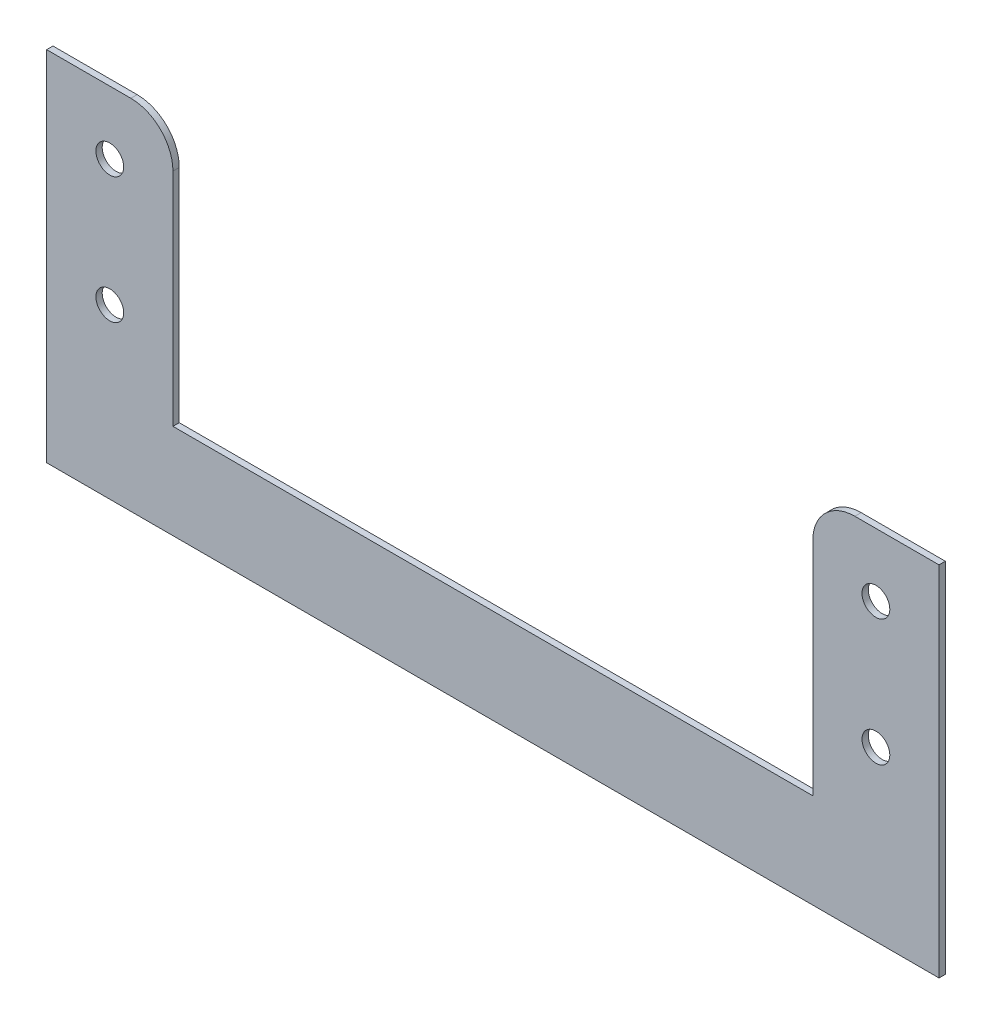
ISO-10303-21;
HEADER;
FILE_DESCRIPTION(('STEP AP214'),'2;1');
FILE_NAME('part.step','',(''),(''),'','','');
FILE_SCHEMA(('AUTOMOTIVE_DESIGN { 1 0 10303 214 1 1 1 1 }'));
ENDSEC;
DATA;
#1=APPLICATION_CONTEXT('core data for automotive mechanical design processes');
#2=APPLICATION_PROTOCOL_DEFINITION('international standard','automotive_design',2000,#1);
#3=PRODUCT_CONTEXT('',#1,'mechanical');
#4=PRODUCT('Part','Part','',(#3));
#5=PRODUCT_RELATED_PRODUCT_CATEGORY('part','',(#4));
#6=PRODUCT_DEFINITION_FORMATION('','',#4);
#7=PRODUCT_DEFINITION_CONTEXT('part definition',#1,'design');
#8=PRODUCT_DEFINITION('design','',#6,#7);
#9=PRODUCT_DEFINITION_SHAPE('','',#8);
#10=(LENGTH_UNIT() NAMED_UNIT(*) SI_UNIT(.MILLI.,.METRE.));
#11=(NAMED_UNIT(*) PLANE_ANGLE_UNIT() SI_UNIT($,.RADIAN.));
#12=(NAMED_UNIT(*) SI_UNIT($,.STERADIAN.) SOLID_ANGLE_UNIT());
#13=UNCERTAINTY_MEASURE_WITH_UNIT(LENGTH_MEASURE(1.E-05),#10,'distance_accuracy_value','');
#14=(GEOMETRIC_REPRESENTATION_CONTEXT(3) GLOBAL_UNCERTAINTY_ASSIGNED_CONTEXT((#13)) GLOBAL_UNIT_ASSIGNED_CONTEXT((#10,
#11,#12)) REPRESENTATION_CONTEXT('',''));
#15=CARTESIAN_POINT('',(0.,0.,0.));
#16=DIRECTION('',(0.,0.,1.));
#17=DIRECTION('',(1.,0.,0.));
#18=AXIS2_PLACEMENT_3D('',#15,#16,#17);
#19=CARTESIAN_POINT('',(0.,0.,3.));
#20=DIRECTION('',(0.,0.,-1.));
#21=DIRECTION('',(-1.,0.,0.));
#22=AXIS2_PLACEMENT_3D('',#19,#20,#21);
#23=PLANE('',#22);
#24=DIRECTION('',(-1.,0.,0.));
#25=VECTOR('',#24,1.);
#26=CARTESIAN_POINT('',(152.,125.,3.));
#27=LINE('',#26,#25);
#28=CARTESIAN_POINT('',(212.,125.,3.));
#29=VERTEX_POINT('',#28);
#30=CARTESIAN_POINT('',(172.,125.,3.));
#31=VERTEX_POINT('',#30);
#32=EDGE_CURVE('E128',#29,#31,#27,.T.);
#33=ORIENTED_EDGE('',*,*,#32,.T.);
#34=CARTESIAN_POINT('',(172.,105.,3.));
#35=DIRECTION('',(0.,0.,-1.));
#36=DIRECTION('',(-1.,0.,0.));
#37=AXIS2_PLACEMENT_3D('',#34,#35,#36);
#38=CIRCLE('',#37,20.);
#39=CARTESIAN_POINT('',(152.,105.,3.));
#40=VERTEX_POINT('',#39);
#41=EDGE_CURVE('E124',#31,#40,#38,.F.);
#42=ORIENTED_EDGE('',*,*,#41,.T.);
#43=DIRECTION('',(0.,-1.,0.));
#44=VECTOR('',#43,1.);
#45=CARTESIAN_POINT('',(152.,0.,3.));
#46=LINE('',#45,#44);
#47=CARTESIAN_POINT('',(152.,0.,3.));
#48=VERTEX_POINT('',#47);
#49=EDGE_CURVE('E116',#40,#48,#46,.T.);
#50=ORIENTED_EDGE('',*,*,#49,.T.);
#51=DIRECTION('',(-1.,0.,0.));
#52=VECTOR('',#51,1.);
#53=CARTESIAN_POINT('',(152.,0.,3.));
#54=LINE('',#53,#52);
#55=CARTESIAN_POINT('',(-152.,0.,3.));
#56=VERTEX_POINT('',#55);
#57=EDGE_CURVE('E121',#48,#56,#54,.T.);
#58=ORIENTED_EDGE('',*,*,#57,.T.);
#59=DIRECTION('',(0.,1.,0.));
#60=VECTOR('',#59,1.);
#61=CARTESIAN_POINT('',(-152.,0.,3.));
#62=LINE('',#61,#60);
#63=CARTESIAN_POINT('',(-152.,105.,3.));
#64=VERTEX_POINT('',#63);
#65=EDGE_CURVE('E142',#56,#64,#62,.T.);
#66=ORIENTED_EDGE('',*,*,#65,.T.);
#67=CARTESIAN_POINT('',(-172.,105.,3.));
#68=DIRECTION('',(0.,0.,-1.));
#69=DIRECTION('',(-1.,0.,0.));
#70=AXIS2_PLACEMENT_3D('',#67,#68,#69);
#71=CIRCLE('',#70,20.);
#72=CARTESIAN_POINT('',(-172.,125.,3.));
#73=VERTEX_POINT('',#72);
#74=EDGE_CURVE('E56',#64,#73,#71,.F.);
#75=ORIENTED_EDGE('',*,*,#74,.T.);
#76=DIRECTION('',(-1.,0.,0.));
#77=VECTOR('',#76,1.);
#78=CARTESIAN_POINT('',(-152.,125.,3.));
#79=LINE('',#78,#77);
#80=CARTESIAN_POINT('',(-212.,125.,3.));
#81=VERTEX_POINT('',#80);
#82=EDGE_CURVE('E144',#73,#81,#79,.T.);
#83=ORIENTED_EDGE('',*,*,#82,.T.);
#84=DIRECTION('',(0.,-1.,0.));
#85=VECTOR('',#84,1.);
#86=CARTESIAN_POINT('',(-212.,125.,3.));
#87=LINE('',#86,#85);
#88=CARTESIAN_POINT('',(-212.,-45.,3.));
#89=VERTEX_POINT('',#88);
#90=EDGE_CURVE('E149',#81,#89,#87,.T.);
#91=ORIENTED_EDGE('',*,*,#90,.T.);
#92=DIRECTION('',(1.,0.,0.));
#93=VECTOR('',#92,1.);
#94=CARTESIAN_POINT('',(-212.,-45.,3.));
#95=LINE('',#94,#93);
#96=CARTESIAN_POINT('',(212.,-45.,3.));
#97=VERTEX_POINT('',#96);
#98=EDGE_CURVE('E151',#89,#97,#95,.T.);
#99=ORIENTED_EDGE('',*,*,#98,.T.);
#100=DIRECTION('',(0.,1.,0.));
#101=VECTOR('',#100,1.);
#102=CARTESIAN_POINT('',(212.,125.,3.));
#103=LINE('',#102,#101);
#104=EDGE_CURVE('E153',#97,#29,#103,.T.);
#105=ORIENTED_EDGE('',*,*,#104,.T.);
#106=EDGE_LOOP('',(#33,#42,#50,#58,#66,#75,#83,#91,#99,#105));
#107=FACE_BOUND('',#106,.T.);
#108=CARTESIAN_POINT('',(-182.,94.9999999999999,3.));
#109=DIRECTION('',(0.,0.,1.));
#110=DIRECTION('',(1.,0.,0.));
#111=AXIS2_PLACEMENT_3D('',#108,#109,#110);
#112=CIRCLE('',#111,6.60000000000004);
#113=CARTESIAN_POINT('',(-175.4,94.9999999999999,3.));
#114=VERTEX_POINT('',#113);
#115=EDGE_CURVE('E159',#114,#114,#112,.T.);
#116=ORIENTED_EDGE('',*,*,#115,.F.);
#117=EDGE_LOOP('',(#116));
#118=FACE_BOUND('',#117,.T.);
#119=CARTESIAN_POINT('',(-182.,34.9999999999999,3.));
#120=DIRECTION('',(0.,0.,1.));
#121=DIRECTION('',(1.,0.,0.));
#122=AXIS2_PLACEMENT_3D('',#119,#120,#121);
#123=CIRCLE('',#122,6.60000000000007);
#124=CARTESIAN_POINT('',(-175.4,34.9999999999999,3.));
#125=VERTEX_POINT('',#124);
#126=EDGE_CURVE('E228',#125,#125,#123,.T.);
#127=ORIENTED_EDGE('',*,*,#126,.F.);
#128=EDGE_LOOP('',(#127));
#129=FACE_BOUND('',#128,.T.);
#130=CARTESIAN_POINT('',(182.,34.9999999999999,3.));
#131=DIRECTION('',(0.,0.,1.));
#132=DIRECTION('',(-1.,0.,0.));
#133=AXIS2_PLACEMENT_3D('',#130,#131,#132);
#134=CIRCLE('',#133,6.60000000000007);
#135=CARTESIAN_POINT('',(175.4,34.9999999999999,3.));
#136=VERTEX_POINT('',#135);
#137=EDGE_CURVE('E234',#136,#136,#134,.T.);
#138=ORIENTED_EDGE('',*,*,#137,.F.);
#139=EDGE_LOOP('',(#138));
#140=FACE_BOUND('',#139,.T.);
#141=CARTESIAN_POINT('',(182.,94.9999999999999,3.));
#142=DIRECTION('',(0.,0.,1.));
#143=DIRECTION('',(-1.,0.,0.));
#144=AXIS2_PLACEMENT_3D('',#141,#142,#143);
#145=CIRCLE('',#144,6.60000000000004);
#146=CARTESIAN_POINT('',(175.4,94.9999999999999,3.));
#147=VERTEX_POINT('',#146);
#148=EDGE_CURVE('E240',#147,#147,#145,.T.);
#149=ORIENTED_EDGE('',*,*,#148,.F.);
#150=EDGE_LOOP('',(#149));
#151=FACE_BOUND('',#150,.T.);
#152=ADVANCED_FACE('F41',(#107,#118,#129,#140,#151),#23,.F.);
#153=CARTESIAN_POINT('',(0.,0.,0.));
#154=DIRECTION('',(0.,0.,-1.));
#155=DIRECTION('',(-1.,0.,0.));
#156=AXIS2_PLACEMENT_3D('',#153,#154,#155);
#157=PLANE('',#156);
#158=CARTESIAN_POINT('',(182.,34.9999999999999,0.));
#159=DIRECTION('',(0.,0.,1.));
#160=DIRECTION('',(-1.,0.,0.));
#161=AXIS2_PLACEMENT_3D('',#158,#159,#160);
#162=CIRCLE('',#161,6.60000000000007);
#163=CARTESIAN_POINT('',(175.4,34.9999999999999,0.));
#164=VERTEX_POINT('',#163);
#165=EDGE_CURVE('E237',#164,#164,#162,.T.);
#166=ORIENTED_EDGE('',*,*,#165,.T.);
#167=EDGE_LOOP('',(#166));
#168=FACE_BOUND('',#167,.T.);
#169=CARTESIAN_POINT('',(-182.,94.9999999999999,0.));
#170=DIRECTION('',(0.,0.,1.));
#171=DIRECTION('',(1.,0.,0.));
#172=AXIS2_PLACEMENT_3D('',#169,#170,#171);
#173=CIRCLE('',#172,6.60000000000004);
#174=CARTESIAN_POINT('',(-175.4,94.9999999999999,0.));
#175=VERTEX_POINT('',#174);
#176=EDGE_CURVE('E225',#175,#175,#173,.T.);
#177=ORIENTED_EDGE('',*,*,#176,.T.);
#178=EDGE_LOOP('',(#177));
#179=FACE_BOUND('',#178,.T.);
#180=DIRECTION('',(0.,-1.,0.));
#181=VECTOR('',#180,1.);
#182=CARTESIAN_POINT('',(152.,0.,0.));
#183=LINE('',#182,#181);
#184=CARTESIAN_POINT('',(152.,105.,0.));
#185=VERTEX_POINT('',#184);
#186=CARTESIAN_POINT('',(152.,0.,0.));
#187=VERTEX_POINT('',#186);
#188=EDGE_CURVE('E134',#185,#187,#183,.T.);
#189=ORIENTED_EDGE('',*,*,#188,.F.);
#190=CARTESIAN_POINT('',(172.,105.,0.));
#191=DIRECTION('',(0.,0.,-1.));
#192=DIRECTION('',(-1.,0.,0.));
#193=AXIS2_PLACEMENT_3D('',#190,#191,#192);
#194=CIRCLE('',#193,20.);
#195=CARTESIAN_POINT('',(172.,125.,0.));
#196=VERTEX_POINT('',#195);
#197=EDGE_CURVE('E188',#185,#196,#194,.T.);
#198=ORIENTED_EDGE('',*,*,#197,.T.);
#199=DIRECTION('',(-1.,0.,0.));
#200=VECTOR('',#199,1.);
#201=CARTESIAN_POINT('',(152.,125.,0.));
#202=LINE('',#201,#200);
#203=CARTESIAN_POINT('',(212.,125.,0.));
#204=VERTEX_POINT('',#203);
#205=EDGE_CURVE('E156',#204,#196,#202,.T.);
#206=ORIENTED_EDGE('',*,*,#205,.F.);
#207=DIRECTION('',(0.,1.,0.));
#208=VECTOR('',#207,1.);
#209=CARTESIAN_POINT('',(212.,125.,0.));
#210=LINE('',#209,#208);
#211=CARTESIAN_POINT('',(212.,-45.,0.));
#212=VERTEX_POINT('',#211);
#213=EDGE_CURVE('E171',#212,#204,#210,.T.);
#214=ORIENTED_EDGE('',*,*,#213,.F.);
#215=DIRECTION('',(1.,0.,0.));
#216=VECTOR('',#215,1.);
#217=CARTESIAN_POINT('',(-212.,-45.,0.));
#218=LINE('',#217,#216);
#219=CARTESIAN_POINT('',(-212.,-45.,0.));
#220=VERTEX_POINT('',#219);
#221=EDGE_CURVE('E169',#220,#212,#218,.T.);
#222=ORIENTED_EDGE('',*,*,#221,.F.);
#223=DIRECTION('',(0.,-1.,0.));
#224=VECTOR('',#223,1.);
#225=CARTESIAN_POINT('',(-212.,125.,0.));
#226=LINE('',#225,#224);
#227=CARTESIAN_POINT('',(-212.,125.,0.));
#228=VERTEX_POINT('',#227);
#229=EDGE_CURVE('E167',#228,#220,#226,.T.);
#230=ORIENTED_EDGE('',*,*,#229,.F.);
#231=DIRECTION('',(-1.,0.,0.));
#232=VECTOR('',#231,1.);
#233=CARTESIAN_POINT('',(-152.,125.,0.));
#234=LINE('',#233,#232);
#235=CARTESIAN_POINT('',(-172.,125.,0.));
#236=VERTEX_POINT('',#235);
#237=EDGE_CURVE('E165',#236,#228,#234,.T.);
#238=ORIENTED_EDGE('',*,*,#237,.F.);
#239=CARTESIAN_POINT('',(-172.,105.,0.));
#240=DIRECTION('',(0.,0.,-1.));
#241=DIRECTION('',(-1.,0.,0.));
#242=AXIS2_PLACEMENT_3D('',#239,#240,#241);
#243=CIRCLE('',#242,20.);
#244=CARTESIAN_POINT('',(-152.,105.,0.));
#245=VERTEX_POINT('',#244);
#246=EDGE_CURVE('E186',#236,#245,#243,.T.);
#247=ORIENTED_EDGE('',*,*,#246,.T.);
#248=DIRECTION('',(0.,1.,0.));
#249=VECTOR('',#248,1.);
#250=CARTESIAN_POINT('',(-152.,0.,0.));
#251=LINE('',#250,#249);
#252=CARTESIAN_POINT('',(-152.,0.,0.));
#253=VERTEX_POINT('',#252);
#254=EDGE_CURVE('E163',#253,#245,#251,.T.);
#255=ORIENTED_EDGE('',*,*,#254,.F.);
#256=DIRECTION('',(-1.,0.,0.));
#257=VECTOR('',#256,1.);
#258=CARTESIAN_POINT('',(152.,0.,0.));
#259=LINE('',#258,#257);
#260=EDGE_CURVE('E161',#187,#253,#259,.T.);
#261=ORIENTED_EDGE('',*,*,#260,.F.);
#262=EDGE_LOOP('',(#189,#198,#206,#214,#222,#230,#238,#247,#255,#261));
#263=FACE_BOUND('',#262,.T.);
#264=CARTESIAN_POINT('',(-182.,34.9999999999999,0.));
#265=DIRECTION('',(0.,0.,1.));
#266=DIRECTION('',(1.,0.,0.));
#267=AXIS2_PLACEMENT_3D('',#264,#265,#266);
#268=CIRCLE('',#267,6.60000000000007);
#269=CARTESIAN_POINT('',(-175.4,34.9999999999999,0.));
#270=VERTEX_POINT('',#269);
#271=EDGE_CURVE('E231',#270,#270,#268,.T.);
#272=ORIENTED_EDGE('',*,*,#271,.T.);
#273=EDGE_LOOP('',(#272));
#274=FACE_BOUND('',#273,.T.);
#275=CARTESIAN_POINT('',(182.,94.9999999999999,0.));
#276=DIRECTION('',(0.,0.,1.));
#277=DIRECTION('',(-1.,0.,0.));
#278=AXIS2_PLACEMENT_3D('',#275,#276,#277);
#279=CIRCLE('',#278,6.60000000000004);
#280=CARTESIAN_POINT('',(175.4,94.9999999999999,0.));
#281=VERTEX_POINT('',#280);
#282=EDGE_CURVE('E243',#281,#281,#279,.T.);
#283=ORIENTED_EDGE('',*,*,#282,.T.);
#284=EDGE_LOOP('',(#283));
#285=FACE_BOUND('',#284,.T.);
#286=ADVANCED_FACE('F202',(#168,#179,#263,#274,#285),#157,.T.);
#287=CARTESIAN_POINT('',(152.,125.,3.));
#288=DIRECTION('',(0.,-1.,0.));
#289=DIRECTION('',(0.,0.,-1.));
#290=AXIS2_PLACEMENT_3D('',#287,#288,#289);
#291=PLANE('',#290);
#292=ORIENTED_EDGE('',*,*,#205,.T.);
#293=DIRECTION('',(0.,0.,-1.));
#294=VECTOR('',#293,1.);
#295=CARTESIAN_POINT('',(172.,125.,3.));
#296=LINE('',#295,#294);
#297=EDGE_CURVE('E190',#196,#31,#296,.F.);
#298=ORIENTED_EDGE('',*,*,#297,.T.);
#299=ORIENTED_EDGE('',*,*,#32,.F.);
#300=DIRECTION('',(0.,0.,-1.));
#301=VECTOR('',#300,1.);
#302=CARTESIAN_POINT('',(212.,125.,3.));
#303=LINE('',#302,#301);
#304=EDGE_CURVE('E155',#29,#204,#303,.T.);
#305=ORIENTED_EDGE('',*,*,#304,.T.);
#306=EDGE_LOOP('',(#292,#298,#299,#305));
#307=FACE_BOUND('',#306,.T.);
#308=ADVANCED_FACE('F222',(#307),#291,.F.);
#309=CARTESIAN_POINT('',(152.,0.,3.));
#310=DIRECTION('',(1.,0.,0.));
#311=DIRECTION('',(0.,0.,-1.));
#312=AXIS2_PLACEMENT_3D('',#309,#310,#311);
#313=PLANE('',#312);
#314=ORIENTED_EDGE('',*,*,#49,.F.);
#315=DIRECTION('',(0.,0.,-1.));
#316=VECTOR('',#315,1.);
#317=CARTESIAN_POINT('',(152.,105.,3.));
#318=LINE('',#317,#316);
#319=EDGE_CURVE('E137',#40,#185,#318,.T.);
#320=ORIENTED_EDGE('',*,*,#319,.T.);
#321=ORIENTED_EDGE('',*,*,#188,.T.);
#322=DIRECTION('',(0.,0.,-1.));
#323=VECTOR('',#322,1.);
#324=CARTESIAN_POINT('',(152.,0.,3.));
#325=LINE('',#324,#323);
#326=EDGE_CURVE('E131',#48,#187,#325,.T.);
#327=ORIENTED_EDGE('',*,*,#326,.F.);
#328=EDGE_LOOP('',(#314,#320,#321,#327));
#329=FACE_BOUND('',#328,.T.);
#330=ADVANCED_FACE('F132',(#329),#313,.F.);
#331=CARTESIAN_POINT('',(152.,0.,3.));
#332=DIRECTION('',(0.,-1.,0.));
#333=DIRECTION('',(0.,0.,-1.));
#334=AXIS2_PLACEMENT_3D('',#331,#332,#333);
#335=PLANE('',#334);
#336=ORIENTED_EDGE('',*,*,#260,.T.);
#337=DIRECTION('',(0.,0.,-1.));
#338=VECTOR('',#337,1.);
#339=CARTESIAN_POINT('',(-152.,0.,3.));
#340=LINE('',#339,#338);
#341=EDGE_CURVE('E138',#56,#253,#340,.T.);
#342=ORIENTED_EDGE('',*,*,#341,.F.);
#343=ORIENTED_EDGE('',*,*,#57,.F.);
#344=ORIENTED_EDGE('',*,*,#326,.T.);
#345=EDGE_LOOP('',(#336,#342,#343,#344));
#346=FACE_BOUND('',#345,.T.);
#347=ADVANCED_FACE('F140',(#346),#335,.F.);
#348=CARTESIAN_POINT('',(-152.,0.,3.));
#349=DIRECTION('',(-1.,0.,0.));
#350=DIRECTION('',(0.,0.,1.));
#351=AXIS2_PLACEMENT_3D('',#348,#349,#350);
#352=PLANE('',#351);
#353=ORIENTED_EDGE('',*,*,#254,.T.);
#354=DIRECTION('',(0.,0.,-1.));
#355=VECTOR('',#354,1.);
#356=CARTESIAN_POINT('',(-152.,105.,3.));
#357=LINE('',#356,#355);
#358=EDGE_CURVE('E11',#245,#64,#357,.F.);
#359=ORIENTED_EDGE('',*,*,#358,.T.);
#360=ORIENTED_EDGE('',*,*,#65,.F.);
#361=ORIENTED_EDGE('',*,*,#341,.T.);
#362=EDGE_LOOP('',(#353,#359,#360,#361));
#363=FACE_BOUND('',#362,.T.);
#364=ADVANCED_FACE('F272',(#363),#352,.F.);
#365=CARTESIAN_POINT('',(-152.,125.,3.));
#366=DIRECTION('',(0.,-1.,0.));
#367=DIRECTION('',(0.,0.,-1.));
#368=AXIS2_PLACEMENT_3D('',#365,#366,#367);
#369=PLANE('',#368);
#370=ORIENTED_EDGE('',*,*,#82,.F.);
#371=DIRECTION('',(0.,0.,-1.));
#372=VECTOR('',#371,1.);
#373=CARTESIAN_POINT('',(-172.,125.,3.));
#374=LINE('',#373,#372);
#375=EDGE_CURVE('E49',#73,#236,#374,.T.);
#376=ORIENTED_EDGE('',*,*,#375,.T.);
#377=ORIENTED_EDGE('',*,*,#237,.T.);
#378=DIRECTION('',(0.,0.,-1.));
#379=VECTOR('',#378,1.);
#380=CARTESIAN_POINT('',(-212.,125.,3.));
#381=LINE('',#380,#379);
#382=EDGE_CURVE('E181',#81,#228,#381,.T.);
#383=ORIENTED_EDGE('',*,*,#382,.F.);
#384=EDGE_LOOP('',(#370,#376,#377,#383));
#385=FACE_BOUND('',#384,.T.);
#386=ADVANCED_FACE('F197',(#385),#369,.F.);
#387=CARTESIAN_POINT('',(-212.,125.,3.));
#388=DIRECTION('',(1.,0.,0.));
#389=DIRECTION('',(0.,0.,-1.));
#390=AXIS2_PLACEMENT_3D('',#387,#388,#389);
#391=PLANE('',#390);
#392=ORIENTED_EDGE('',*,*,#229,.T.);
#393=DIRECTION('',(0.,0.,-1.));
#394=VECTOR('',#393,1.);
#395=CARTESIAN_POINT('',(-212.,-45.,3.));
#396=LINE('',#395,#394);
#397=EDGE_CURVE('E178',#89,#220,#396,.T.);
#398=ORIENTED_EDGE('',*,*,#397,.F.);
#399=ORIENTED_EDGE('',*,*,#90,.F.);
#400=ORIENTED_EDGE('',*,*,#382,.T.);
#401=EDGE_LOOP('',(#392,#398,#399,#400));
#402=FACE_BOUND('',#401,.T.);
#403=ADVANCED_FACE('F209',(#402),#391,.F.);
#404=CARTESIAN_POINT('',(-212.,-45.,3.));
#405=DIRECTION('',(0.,1.,0.));
#406=DIRECTION('',(0.,0.,1.));
#407=AXIS2_PLACEMENT_3D('',#404,#405,#406);
#408=PLANE('',#407);
#409=ORIENTED_EDGE('',*,*,#221,.T.);
#410=DIRECTION('',(0.,0.,-1.));
#411=VECTOR('',#410,1.);
#412=CARTESIAN_POINT('',(212.,-45.,3.));
#413=LINE('',#412,#411);
#414=EDGE_CURVE('E175',#97,#212,#413,.T.);
#415=ORIENTED_EDGE('',*,*,#414,.F.);
#416=ORIENTED_EDGE('',*,*,#98,.F.);
#417=ORIENTED_EDGE('',*,*,#397,.T.);
#418=EDGE_LOOP('',(#409,#415,#416,#417));
#419=FACE_BOUND('',#418,.T.);
#420=ADVANCED_FACE('F213',(#419),#408,.F.);
#421=CARTESIAN_POINT('',(212.,125.,3.));
#422=DIRECTION('',(-1.,0.,0.));
#423=DIRECTION('',(0.,0.,1.));
#424=AXIS2_PLACEMENT_3D('',#421,#422,#423);
#425=PLANE('',#424);
#426=ORIENTED_EDGE('',*,*,#213,.T.);
#427=ORIENTED_EDGE('',*,*,#304,.F.);
#428=ORIENTED_EDGE('',*,*,#104,.F.);
#429=ORIENTED_EDGE('',*,*,#414,.T.);
#430=EDGE_LOOP('',(#426,#427,#428,#429));
#431=FACE_BOUND('',#430,.T.);
#432=ADVANCED_FACE('F219',(#431),#425,.F.);
#433=CARTESIAN_POINT('',(-182.,94.9999999999999,3.));
#434=DIRECTION('',(0.,0.,-1.));
#435=DIRECTION('',(-1.,0.,0.));
#436=AXIS2_PLACEMENT_3D('',#433,#434,#435);
#437=CYLINDRICAL_SURFACE('',#436,6.60000000000004);
#438=ORIENTED_EDGE('',*,*,#115,.T.);
#439=EDGE_LOOP('',(#438));
#440=FACE_BOUND('',#439,.T.);
#441=ORIENTED_EDGE('',*,*,#176,.F.);
#442=EDGE_LOOP('',(#441));
#443=FACE_BOUND('',#442,.T.);
#444=ADVANCED_FACE('F261',(#440,#443),#437,.F.);
#445=CARTESIAN_POINT('',(-182.,34.9999999999999,3.));
#446=DIRECTION('',(0.,0.,-1.));
#447=DIRECTION('',(-1.,0.,0.));
#448=AXIS2_PLACEMENT_3D('',#445,#446,#447);
#449=CYLINDRICAL_SURFACE('',#448,6.60000000000007);
#450=ORIENTED_EDGE('',*,*,#126,.T.);
#451=EDGE_LOOP('',(#450));
#452=FACE_BOUND('',#451,.T.);
#453=ORIENTED_EDGE('',*,*,#271,.F.);
#454=EDGE_LOOP('',(#453));
#455=FACE_BOUND('',#454,.T.);
#456=ADVANCED_FACE('F291',(#452,#455),#449,.F.);
#457=CARTESIAN_POINT('',(182.,34.9999999999999,3.));
#458=DIRECTION('',(0.,0.,-1.));
#459=DIRECTION('',(-1.,0.,0.));
#460=AXIS2_PLACEMENT_3D('',#457,#458,#459);
#461=CYLINDRICAL_SURFACE('',#460,6.60000000000007);
#462=ORIENTED_EDGE('',*,*,#137,.T.);
#463=EDGE_LOOP('',(#462));
#464=FACE_BOUND('',#463,.T.);
#465=ORIENTED_EDGE('',*,*,#165,.F.);
#466=EDGE_LOOP('',(#465));
#467=FACE_BOUND('',#466,.T.);
#468=ADVANCED_FACE('F286',(#464,#467),#461,.F.);
#469=CARTESIAN_POINT('',(182.,94.9999999999999,3.));
#470=DIRECTION('',(0.,0.,-1.));
#471=DIRECTION('',(-1.,0.,0.));
#472=AXIS2_PLACEMENT_3D('',#469,#470,#471);
#473=CYLINDRICAL_SURFACE('',#472,6.60000000000004);
#474=ORIENTED_EDGE('',*,*,#148,.T.);
#475=EDGE_LOOP('',(#474));
#476=FACE_BOUND('',#475,.T.);
#477=ORIENTED_EDGE('',*,*,#282,.F.);
#478=EDGE_LOOP('',(#477));
#479=FACE_BOUND('',#478,.T.);
#480=ADVANCED_FACE('F249',(#476,#479),#473,.F.);
#481=CARTESIAN_POINT('',(172.,105.,3.));
#482=DIRECTION('',(0.,0.,-1.));
#483=DIRECTION('',(-1.,0.,0.));
#484=AXIS2_PLACEMENT_3D('',#481,#482,#483);
#485=CYLINDRICAL_SURFACE('',#484,20.);
#486=ORIENTED_EDGE('',*,*,#41,.F.);
#487=ORIENTED_EDGE('',*,*,#297,.F.);
#488=ORIENTED_EDGE('',*,*,#197,.F.);
#489=ORIENTED_EDGE('',*,*,#319,.F.);
#490=EDGE_LOOP('',(#486,#487,#488,#489));
#491=FACE_BOUND('',#490,.T.);
#492=ADVANCED_FACE('F280',(#491),#485,.T.);
#493=CARTESIAN_POINT('',(-172.,105.,3.));
#494=DIRECTION('',(0.,0.,-1.));
#495=DIRECTION('',(-1.,0.,0.));
#496=AXIS2_PLACEMENT_3D('',#493,#494,#495);
#497=CYLINDRICAL_SURFACE('',#496,20.);
#498=ORIENTED_EDGE('',*,*,#74,.F.);
#499=ORIENTED_EDGE('',*,*,#358,.F.);
#500=ORIENTED_EDGE('',*,*,#246,.F.);
#501=ORIENTED_EDGE('',*,*,#375,.F.);
#502=EDGE_LOOP('',(#498,#499,#500,#501));
#503=FACE_BOUND('',#502,.T.);
#504=ADVANCED_FACE('F43',(#503),#497,.T.);
#505=CLOSED_SHELL('',(#152,#286,#308,#330,#347,#364,#386,#403,#420,#432,#444,#456,#468,#480,
#492,#504));
#506=MANIFOLD_SOLID_BREP('B2',#505);
#507=ADVANCED_BREP_SHAPE_REPRESENTATION('',(#18,#506),#14);
#508=SHAPE_DEFINITION_REPRESENTATION(#9,#507);
ENDSEC;
END-ISO-10303-21;
